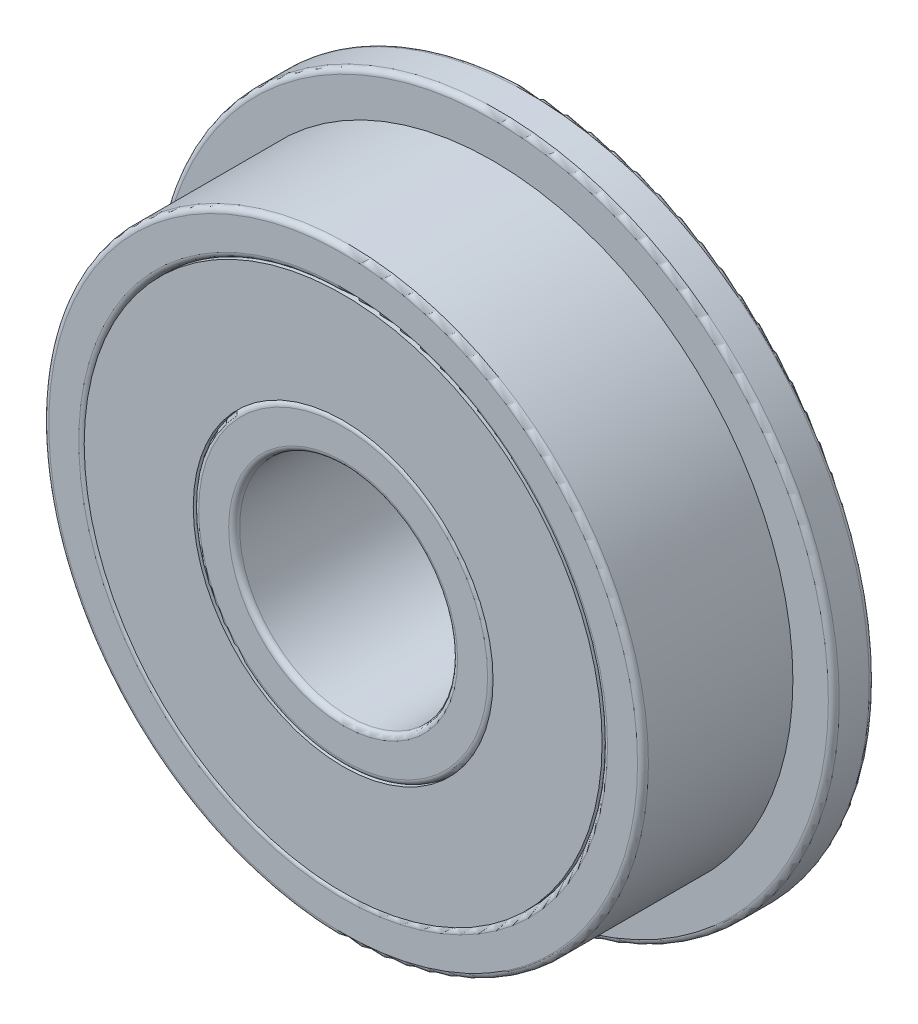
ISO-10303-21;
HEADER;
FILE_DESCRIPTION(('STEP AP214'),'2;1');
FILE_NAME('part.step','',(''),(''),'','','');
FILE_SCHEMA(('AUTOMOTIVE_DESIGN { 1 0 10303 214 1 1 1 1 }'));
ENDSEC;
DATA;
#1=APPLICATION_CONTEXT('core data for automotive mechanical design processes');
#2=APPLICATION_PROTOCOL_DEFINITION('international standard','automotive_design',2000,#1);
#3=PRODUCT_CONTEXT('',#1,'mechanical');
#4=PRODUCT('Part','Part','',(#3));
#5=PRODUCT_RELATED_PRODUCT_CATEGORY('part','',(#4));
#6=PRODUCT_DEFINITION_FORMATION('','',#4);
#7=PRODUCT_DEFINITION_CONTEXT('part definition',#1,'design');
#8=PRODUCT_DEFINITION('design','',#6,#7);
#9=PRODUCT_DEFINITION_SHAPE('','',#8);
#10=(LENGTH_UNIT() NAMED_UNIT(*) SI_UNIT(.MILLI.,.METRE.));
#11=(NAMED_UNIT(*) PLANE_ANGLE_UNIT() SI_UNIT($,.RADIAN.));
#12=(NAMED_UNIT(*) SI_UNIT($,.STERADIAN.) SOLID_ANGLE_UNIT());
#13=UNCERTAINTY_MEASURE_WITH_UNIT(LENGTH_MEASURE(1.E-05),#10,'distance_accuracy_value','');
#14=(GEOMETRIC_REPRESENTATION_CONTEXT(3) GLOBAL_UNCERTAINTY_ASSIGNED_CONTEXT((#13)) GLOBAL_UNIT_ASSIGNED_CONTEXT((#10,
#11,#12)) REPRESENTATION_CONTEXT('',''));
#15=CARTESIAN_POINT('',(0.,0.,0.));
#16=DIRECTION('',(0.,0.,1.));
#17=DIRECTION('',(1.,0.,0.));
#18=AXIS2_PLACEMENT_3D('',#15,#16,#17);
#19=CARTESIAN_POINT('',(0.,0.,7.));
#20=DIRECTION('',(0.,0.,-1.));
#21=DIRECTION('',(-1.,0.,0.));
#22=AXIS2_PLACEMENT_3D('',#19,#20,#21);
#23=CYLINDRICAL_SURFACE('',#22,5.5);
#24=CARTESIAN_POINT('',(0.,0.,7.));
#25=DIRECTION('',(0.,0.,1.));
#26=DIRECTION('',(1.,0.,0.));
#27=AXIS2_PLACEMENT_3D('',#24,#25,#26);
#28=CIRCLE('',#27,5.5);
#29=CARTESIAN_POINT('',(5.5,0.,7.));
#30=VERTEX_POINT('',#29);
#31=EDGE_CURVE('E54',#30,#30,#28,.T.);
#32=ORIENTED_EDGE('',*,*,#31,.T.);
#33=EDGE_LOOP('',(#32));
#34=FACE_BOUND('',#33,.T.);
#35=CARTESIAN_POINT('',(0.,0.,0.));
#36=DIRECTION('',(0.,0.,1.));
#37=DIRECTION('',(1.,0.,0.));
#38=AXIS2_PLACEMENT_3D('',#35,#36,#37);
#39=CIRCLE('',#38,5.5);
#40=CARTESIAN_POINT('',(5.5,0.,0.));
#41=VERTEX_POINT('',#40);
#42=EDGE_CURVE('E60',#41,#41,#39,.T.);
#43=ORIENTED_EDGE('',*,*,#42,.F.);
#44=EDGE_LOOP('',(#43));
#45=FACE_BOUND('',#44,.T.);
#46=ADVANCED_FACE('F47',(#34,#45),#23,.F.);
#47=CARTESIAN_POINT('',(0.,0.,7.));
#48=DIRECTION('',(0.,0.,-1.));
#49=DIRECTION('',(-1.,0.,0.));
#50=AXIS2_PLACEMENT_3D('',#47,#48,#49);
#51=CYLINDRICAL_SURFACE('',#50,9.5);
#52=CARTESIAN_POINT('',(0.,0.,7.));
#53=DIRECTION('',(0.,0.,1.));
#54=DIRECTION('',(1.,0.,0.));
#55=AXIS2_PLACEMENT_3D('',#52,#53,#54);
#56=CIRCLE('',#55,9.5);
#57=CARTESIAN_POINT('',(9.5,0.,7.));
#58=VERTEX_POINT('',#57);
#59=EDGE_CURVE('E12',#58,#58,#56,.T.);
#60=ORIENTED_EDGE('',*,*,#59,.F.);
#61=EDGE_LOOP('',(#60));
#62=FACE_BOUND('',#61,.T.);
#63=CARTESIAN_POINT('',(0.,0.,0.));
#64=DIRECTION('',(0.,0.,1.));
#65=DIRECTION('',(1.,0.,0.));
#66=AXIS2_PLACEMENT_3D('',#63,#64,#65);
#67=CIRCLE('',#66,9.5);
#68=CARTESIAN_POINT('',(9.5,0.,0.));
#69=VERTEX_POINT('',#68);
#70=EDGE_CURVE('E50',#69,#69,#67,.T.);
#71=ORIENTED_EDGE('',*,*,#70,.T.);
#72=EDGE_LOOP('',(#71));
#73=FACE_BOUND('',#72,.T.);
#74=ADVANCED_FACE('F67',(#62,#73),#51,.T.);
#75=CARTESIAN_POINT('',(0.,0.,7.));
#76=DIRECTION('',(0.,0.,1.));
#77=DIRECTION('',(1.,0.,0.));
#78=AXIS2_PLACEMENT_3D('',#75,#76,#77);
#79=PLANE('',#78);
#80=ORIENTED_EDGE('',*,*,#31,.F.);
#81=EDGE_LOOP('',(#80));
#82=FACE_BOUND('',#81,.T.);
#83=ORIENTED_EDGE('',*,*,#59,.T.);
#84=EDGE_LOOP('',(#83));
#85=FACE_BOUND('',#84,.T.);
#86=ADVANCED_FACE('F71',(#82,#85),#79,.T.);
#87=CARTESIAN_POINT('',(0.,0.,0.));
#88=DIRECTION('',(0.,0.,1.));
#89=DIRECTION('',(1.,0.,0.));
#90=AXIS2_PLACEMENT_3D('',#87,#88,#89);
#91=PLANE('',#90);
#92=ORIENTED_EDGE('',*,*,#42,.T.);
#93=EDGE_LOOP('',(#92));
#94=FACE_BOUND('',#93,.T.);
#95=ORIENTED_EDGE('',*,*,#70,.F.);
#96=EDGE_LOOP('',(#95));
#97=FACE_BOUND('',#96,.T.);
#98=ADVANCED_FACE('F69',(#94,#97),#91,.F.);
#99=CLOSED_SHELL('',(#46,#74,#86,#98));
#100=MANIFOLD_SOLID_BREP('B2',#99);
#101=CARTESIAN_POINT('',(0.,0.,7.));
#102=DIRECTION('',(0.,0.,-1.));
#103=DIRECTION('',(-1.,0.,0.));
#104=AXIS2_PLACEMENT_3D('',#101,#102,#103);
#105=CYLINDRICAL_SURFACE('',#104,4.);
#106=CARTESIAN_POINT('',(0.,0.,6.8));
#107=DIRECTION('',(0.,0.,1.));
#108=DIRECTION('',(1.,0.,0.));
#109=AXIS2_PLACEMENT_3D('',#106,#107,#108);
#110=CIRCLE('',#109,4.);
#111=CARTESIAN_POINT('',(4.,0.,6.8));
#112=VERTEX_POINT('',#111);
#113=EDGE_CURVE('E126',#112,#112,#110,.T.);
#114=ORIENTED_EDGE('',*,*,#113,.T.);
#115=EDGE_LOOP('',(#114));
#116=FACE_BOUND('',#115,.T.);
#117=CARTESIAN_POINT('',(0.,0.,0.2));
#118=DIRECTION('',(0.,0.,1.));
#119=DIRECTION('',(1.,0.,0.));
#120=AXIS2_PLACEMENT_3D('',#117,#118,#119);
#121=CIRCLE('',#120,4.);
#122=CARTESIAN_POINT('',(4.,0.,0.2));
#123=VERTEX_POINT('',#122);
#124=EDGE_CURVE('E130',#123,#123,#121,.F.);
#125=ORIENTED_EDGE('',*,*,#124,.T.);
#126=EDGE_LOOP('',(#125));
#127=FACE_BOUND('',#126,.T.);
#128=ADVANCED_FACE('F115',(#116,#127),#105,.F.);
#129=CARTESIAN_POINT('',(0.,0.,7.));
#130=DIRECTION('',(0.,0.,-1.));
#131=DIRECTION('',(-1.,0.,0.));
#132=AXIS2_PLACEMENT_3D('',#129,#130,#131);
#133=CYLINDRICAL_SURFACE('',#132,5.5);
#134=CARTESIAN_POINT('',(0.,0.,6.8));
#135=DIRECTION('',(0.,0.,1.));
#136=DIRECTION('',(1.,0.,0.));
#137=AXIS2_PLACEMENT_3D('',#134,#135,#136);
#138=CIRCLE('',#137,5.5);
#139=CARTESIAN_POINT('',(5.5,0.,6.8));
#140=VERTEX_POINT('',#139);
#141=EDGE_CURVE('E135',#140,#140,#138,.F.);
#142=ORIENTED_EDGE('',*,*,#141,.T.);
#143=EDGE_LOOP('',(#142));
#144=FACE_BOUND('',#143,.T.);
#145=CARTESIAN_POINT('',(0.,0.,0.2));
#146=DIRECTION('',(0.,0.,1.));
#147=DIRECTION('',(1.,0.,0.));
#148=AXIS2_PLACEMENT_3D('',#145,#146,#147);
#149=CIRCLE('',#148,5.5);
#150=CARTESIAN_POINT('',(5.5,0.,0.2));
#151=VERTEX_POINT('',#150);
#152=EDGE_CURVE('E138',#151,#151,#149,.T.);
#153=ORIENTED_EDGE('',*,*,#152,.T.);
#154=EDGE_LOOP('',(#153));
#155=FACE_BOUND('',#154,.T.);
#156=ADVANCED_FACE('F160',(#144,#155),#133,.T.);
#157=CARTESIAN_POINT('',(0.,0.,7.));
#158=DIRECTION('',(0.,0.,1.));
#159=DIRECTION('',(1.,0.,0.));
#160=AXIS2_PLACEMENT_3D('',#157,#158,#159);
#161=PLANE('',#160);
#162=CARTESIAN_POINT('',(0.,0.,7.));
#163=DIRECTION('',(0.,0.,1.));
#164=DIRECTION('',(1.,0.,0.));
#165=AXIS2_PLACEMENT_3D('',#162,#163,#164);
#166=CIRCLE('',#165,5.3);
#167=CARTESIAN_POINT('',(5.3,0.,7.));
#168=VERTEX_POINT('',#167);
#169=EDGE_CURVE('E141',#168,#168,#166,.T.);
#170=ORIENTED_EDGE('',*,*,#169,.T.);
#171=EDGE_LOOP('',(#170));
#172=FACE_BOUND('',#171,.T.);
#173=CARTESIAN_POINT('',(0.,0.,7.));
#174=DIRECTION('',(0.,0.,1.));
#175=DIRECTION('',(1.,0.,0.));
#176=AXIS2_PLACEMENT_3D('',#173,#174,#175);
#177=CIRCLE('',#176,4.2);
#178=CARTESIAN_POINT('',(4.2,0.,7.));
#179=VERTEX_POINT('',#178);
#180=EDGE_CURVE('E144',#179,#179,#177,.F.);
#181=ORIENTED_EDGE('',*,*,#180,.T.);
#182=EDGE_LOOP('',(#181));
#183=FACE_BOUND('',#182,.T.);
#184=ADVANCED_FACE('F148',(#172,#183),#161,.T.);
#185=CARTESIAN_POINT('',(0.,0.,0.));
#186=DIRECTION('',(0.,0.,1.));
#187=DIRECTION('',(1.,0.,0.));
#188=AXIS2_PLACEMENT_3D('',#185,#186,#187);
#189=PLANE('',#188);
#190=CARTESIAN_POINT('',(0.,0.,0.));
#191=DIRECTION('',(0.,0.,1.));
#192=DIRECTION('',(1.,0.,0.));
#193=AXIS2_PLACEMENT_3D('',#190,#191,#192);
#194=CIRCLE('',#193,5.3);
#195=CARTESIAN_POINT('',(5.3,0.,0.));
#196=VERTEX_POINT('',#195);
#197=EDGE_CURVE('E46',#196,#196,#194,.F.);
#198=ORIENTED_EDGE('',*,*,#197,.T.);
#199=EDGE_LOOP('',(#198));
#200=FACE_BOUND('',#199,.T.);
#201=CARTESIAN_POINT('',(0.,0.,0.));
#202=DIRECTION('',(0.,0.,1.));
#203=DIRECTION('',(1.,0.,0.));
#204=AXIS2_PLACEMENT_3D('',#201,#202,#203);
#205=CIRCLE('',#204,4.2);
#206=CARTESIAN_POINT('',(4.2,0.,0.));
#207=VERTEX_POINT('',#206);
#208=EDGE_CURVE('E122',#207,#207,#205,.T.);
#209=ORIENTED_EDGE('',*,*,#208,.T.);
#210=EDGE_LOOP('',(#209));
#211=FACE_BOUND('',#210,.T.);
#212=ADVANCED_FACE('F175',(#200,#211),#189,.F.);
#213=CARTESIAN_POINT('',(0.,0.,6.8));
#214=DIRECTION('',(0.,0.,1.));
#215=DIRECTION('',(1.,0.,0.));
#216=AXIS2_PLACEMENT_3D('',#213,#214,#215);
#217=TOROIDAL_SURFACE('',#216,5.3,0.2);
#218=ORIENTED_EDGE('',*,*,#141,.F.);
#219=EDGE_LOOP('',(#218));
#220=FACE_BOUND('',#219,.T.);
#221=ORIENTED_EDGE('',*,*,#169,.F.);
#222=EDGE_LOOP('',(#221));
#223=FACE_BOUND('',#222,.T.);
#224=ADVANCED_FACE('F154',(#220,#223),#217,.T.);
#225=CARTESIAN_POINT('',(0.,0.,6.8));
#226=DIRECTION('',(0.,0.,1.));
#227=DIRECTION('',(1.,0.,0.));
#228=AXIS2_PLACEMENT_3D('',#225,#226,#227);
#229=TOROIDAL_SURFACE('',#228,4.2,0.2);
#230=ORIENTED_EDGE('',*,*,#180,.F.);
#231=EDGE_LOOP('',(#230));
#232=FACE_BOUND('',#231,.T.);
#233=ORIENTED_EDGE('',*,*,#113,.F.);
#234=EDGE_LOOP('',(#233));
#235=FACE_BOUND('',#234,.T.);
#236=ADVANCED_FACE('F150',(#232,#235),#229,.T.);
#237=CARTESIAN_POINT('',(0.,0.,0.2));
#238=DIRECTION('',(0.,0.,1.));
#239=DIRECTION('',(1.,0.,0.));
#240=AXIS2_PLACEMENT_3D('',#237,#238,#239);
#241=TOROIDAL_SURFACE('',#240,5.3,0.2);
#242=ORIENTED_EDGE('',*,*,#197,.F.);
#243=EDGE_LOOP('',(#242));
#244=FACE_BOUND('',#243,.T.);
#245=ORIENTED_EDGE('',*,*,#152,.F.);
#246=EDGE_LOOP('',(#245));
#247=FACE_BOUND('',#246,.T.);
#248=ADVANCED_FACE('F153',(#244,#247),#241,.T.);
#249=CARTESIAN_POINT('',(0.,0.,0.2));
#250=DIRECTION('',(0.,0.,1.));
#251=DIRECTION('',(1.,0.,0.));
#252=AXIS2_PLACEMENT_3D('',#249,#250,#251);
#253=TOROIDAL_SURFACE('',#252,4.2,0.2);
#254=ORIENTED_EDGE('',*,*,#124,.F.);
#255=EDGE_LOOP('',(#254));
#256=FACE_BOUND('',#255,.T.);
#257=ORIENTED_EDGE('',*,*,#208,.F.);
#258=EDGE_LOOP('',(#257));
#259=FACE_BOUND('',#258,.T.);
#260=ADVANCED_FACE('F117',(#256,#259),#253,.T.);
#261=CLOSED_SHELL('',(#128,#156,#184,#212,#224,#236,#248,#260));
#262=MANIFOLD_SOLID_BREP('B7',#261);
#263=CARTESIAN_POINT('',(0.,0.,7.));
#264=DIRECTION('',(0.,0.,-1.));
#265=DIRECTION('',(-1.,0.,0.));
#266=AXIS2_PLACEMENT_3D('',#263,#264,#265);
#267=CYLINDRICAL_SURFACE('',#266,9.5);
#268=CARTESIAN_POINT('',(0.,0.,0.2));
#269=DIRECTION('',(0.,0.,1.));
#270=DIRECTION('',(1.,0.,0.));
#271=AXIS2_PLACEMENT_3D('',#268,#269,#270);
#272=CIRCLE('',#271,9.5);
#273=CARTESIAN_POINT('',(9.5,0.,0.2));
#274=VERTEX_POINT('',#273);
#275=EDGE_CURVE('E256',#274,#274,#272,.F.);
#276=ORIENTED_EDGE('',*,*,#275,.T.);
#277=EDGE_LOOP('',(#276));
#278=FACE_BOUND('',#277,.T.);
#279=CARTESIAN_POINT('',(0.,0.,6.8));
#280=DIRECTION('',(0.,0.,1.));
#281=DIRECTION('',(1.,0.,0.));
#282=AXIS2_PLACEMENT_3D('',#279,#280,#281);
#283=CIRCLE('',#282,9.5);
#284=CARTESIAN_POINT('',(9.5,0.,6.8));
#285=VERTEX_POINT('',#284);
#286=EDGE_CURVE('E259',#285,#285,#283,.T.);
#287=ORIENTED_EDGE('',*,*,#286,.T.);
#288=EDGE_LOOP('',(#287));
#289=FACE_BOUND('',#288,.T.);
#290=ADVANCED_FACE('F236',(#278,#289),#267,.F.);
#291=CARTESIAN_POINT('',(0.,0.,7.));
#292=DIRECTION('',(0.,0.,-1.));
#293=DIRECTION('',(-1.,0.,0.));
#294=AXIS2_PLACEMENT_3D('',#291,#292,#293);
#295=CYLINDRICAL_SURFACE('',#294,11.);
#296=CARTESIAN_POINT('',(0.,0.,6.8));
#297=DIRECTION('',(0.,0.,1.));
#298=DIRECTION('',(1.,0.,0.));
#299=AXIS2_PLACEMENT_3D('',#296,#297,#298);
#300=CIRCLE('',#299,11.);
#301=CARTESIAN_POINT('',(11.,0.,6.8));
#302=VERTEX_POINT('',#301);
#303=EDGE_CURVE('E243',#302,#302,#300,.F.);
#304=ORIENTED_EDGE('',*,*,#303,.T.);
#305=EDGE_LOOP('',(#304));
#306=FACE_BOUND('',#305,.T.);
#307=CARTESIAN_POINT('',(0.,0.,1.5));
#308=DIRECTION('',(0.,0.,1.));
#309=DIRECTION('',(1.,0.,0.));
#310=AXIS2_PLACEMENT_3D('',#307,#308,#309);
#311=CIRCLE('',#310,11.);
#312=CARTESIAN_POINT('',(11.,0.,1.5));
#313=VERTEX_POINT('',#312);
#314=EDGE_CURVE('E274',#313,#313,#311,.T.);
#315=ORIENTED_EDGE('',*,*,#314,.T.);
#316=EDGE_LOOP('',(#315));
#317=FACE_BOUND('',#316,.T.);
#318=ADVANCED_FACE('F278',(#306,#317),#295,.T.);
#319=CARTESIAN_POINT('',(0.,0.,7.));
#320=DIRECTION('',(0.,0.,1.));
#321=DIRECTION('',(1.,0.,0.));
#322=AXIS2_PLACEMENT_3D('',#319,#320,#321);
#323=PLANE('',#322);
#324=CARTESIAN_POINT('',(0.,0.,7.));
#325=DIRECTION('',(0.,0.,1.));
#326=DIRECTION('',(1.,0.,0.));
#327=AXIS2_PLACEMENT_3D('',#324,#325,#326);
#328=CIRCLE('',#327,10.8);
#329=CARTESIAN_POINT('',(10.8,0.,7.));
#330=VERTEX_POINT('',#329);
#331=EDGE_CURVE('E247',#330,#330,#328,.T.);
#332=ORIENTED_EDGE('',*,*,#331,.T.);
#333=EDGE_LOOP('',(#332));
#334=FACE_BOUND('',#333,.T.);
#335=CARTESIAN_POINT('',(0.,0.,7.));
#336=DIRECTION('',(0.,0.,1.));
#337=DIRECTION('',(1.,0.,0.));
#338=AXIS2_PLACEMENT_3D('',#335,#336,#337);
#339=CIRCLE('',#338,9.7);
#340=CARTESIAN_POINT('',(9.7,0.,7.));
#341=VERTEX_POINT('',#340);
#342=EDGE_CURVE('E251',#341,#341,#339,.F.);
#343=ORIENTED_EDGE('',*,*,#342,.T.);
#344=EDGE_LOOP('',(#343));
#345=FACE_BOUND('',#344,.T.);
#346=ADVANCED_FACE('F292',(#334,#345),#323,.T.);
#347=CARTESIAN_POINT('',(0.,0.,0.));
#348=DIRECTION('',(0.,0.,1.));
#349=DIRECTION('',(1.,0.,0.));
#350=AXIS2_PLACEMENT_3D('',#347,#348,#349);
#351=PLANE('',#350);
#352=CARTESIAN_POINT('',(0.,0.,0.));
#353=DIRECTION('',(0.,0.,1.));
#354=DIRECTION('',(1.,0.,0.));
#355=AXIS2_PLACEMENT_3D('',#352,#353,#354);
#356=CIRCLE('',#355,12.3);
#357=CARTESIAN_POINT('',(12.3,0.,0.));
#358=VERTEX_POINT('',#357);
#359=EDGE_CURVE('E262',#358,#358,#356,.F.);
#360=ORIENTED_EDGE('',*,*,#359,.T.);
#361=EDGE_LOOP('',(#360));
#362=FACE_BOUND('',#361,.T.);
#363=CARTESIAN_POINT('',(0.,0.,0.));
#364=DIRECTION('',(0.,0.,1.));
#365=DIRECTION('',(1.,0.,0.));
#366=AXIS2_PLACEMENT_3D('',#363,#364,#365);
#367=CIRCLE('',#366,9.7);
#368=CARTESIAN_POINT('',(9.7,0.,0.));
#369=VERTEX_POINT('',#368);
#370=EDGE_CURVE('E265',#369,#369,#367,.T.);
#371=ORIENTED_EDGE('',*,*,#370,.T.);
#372=EDGE_LOOP('',(#371));
#373=FACE_BOUND('',#372,.T.);
#374=ADVANCED_FACE('F283',(#362,#373),#351,.F.);
#375=CARTESIAN_POINT('',(0.,0.,1.5));
#376=DIRECTION('',(0.,0.,1.));
#377=DIRECTION('',(1.,0.,0.));
#378=AXIS2_PLACEMENT_3D('',#375,#376,#377);
#379=PLANE('',#378);
#380=CARTESIAN_POINT('',(0.,0.,1.5));
#381=DIRECTION('',(0.,0.,1.));
#382=DIRECTION('',(1.,0.,0.));
#383=AXIS2_PLACEMENT_3D('',#380,#381,#382);
#384=CIRCLE('',#383,12.3);
#385=CARTESIAN_POINT('',(12.3,0.,1.5));
#386=VERTEX_POINT('',#385);
#387=EDGE_CURVE('E114',#386,#386,#384,.T.);
#388=ORIENTED_EDGE('',*,*,#387,.T.);
#389=EDGE_LOOP('',(#388));
#390=FACE_BOUND('',#389,.T.);
#391=ORIENTED_EDGE('',*,*,#314,.F.);
#392=EDGE_LOOP('',(#391));
#393=FACE_BOUND('',#392,.T.);
#394=ADVANCED_FACE('F280',(#390,#393),#379,.T.);
#395=CARTESIAN_POINT('',(0.,0.,1.5));
#396=DIRECTION('',(0.,0.,-1.));
#397=DIRECTION('',(-1.,0.,0.));
#398=AXIS2_PLACEMENT_3D('',#395,#396,#397);
#399=CYLINDRICAL_SURFACE('',#398,12.5);
#400=CARTESIAN_POINT('',(0.,0.,0.2));
#401=DIRECTION('',(0.,0.,1.));
#402=DIRECTION('',(1.,0.,0.));
#403=AXIS2_PLACEMENT_3D('',#400,#401,#402);
#404=CIRCLE('',#403,12.5);
#405=CARTESIAN_POINT('',(12.5,0.,0.2));
#406=VERTEX_POINT('',#405);
#407=EDGE_CURVE('E268',#406,#406,#404,.T.);
#408=ORIENTED_EDGE('',*,*,#407,.T.);
#409=EDGE_LOOP('',(#408));
#410=FACE_BOUND('',#409,.T.);
#411=CARTESIAN_POINT('',(0.,0.,1.3));
#412=DIRECTION('',(0.,0.,1.));
#413=DIRECTION('',(1.,0.,0.));
#414=AXIS2_PLACEMENT_3D('',#411,#412,#413);
#415=CIRCLE('',#414,12.5);
#416=CARTESIAN_POINT('',(12.5,0.,1.3));
#417=VERTEX_POINT('',#416);
#418=EDGE_CURVE('E271',#417,#417,#415,.F.);
#419=ORIENTED_EDGE('',*,*,#418,.T.);
#420=EDGE_LOOP('',(#419));
#421=FACE_BOUND('',#420,.T.);
#422=ADVANCED_FACE('F282',(#410,#421),#399,.T.);
#423=CARTESIAN_POINT('',(0.,0.,0.2));
#424=DIRECTION('',(0.,0.,1.));
#425=DIRECTION('',(1.,0.,0.));
#426=AXIS2_PLACEMENT_3D('',#423,#424,#425);
#427=TOROIDAL_SURFACE('',#426,12.3,0.2);
#428=ORIENTED_EDGE('',*,*,#359,.F.);
#429=EDGE_LOOP('',(#428));
#430=FACE_BOUND('',#429,.T.);
#431=ORIENTED_EDGE('',*,*,#407,.F.);
#432=EDGE_LOOP('',(#431));
#433=FACE_BOUND('',#432,.T.);
#434=ADVANCED_FACE('F289',(#430,#433),#427,.T.);
#435=CARTESIAN_POINT('',(0.,0.,0.2));
#436=DIRECTION('',(0.,0.,1.));
#437=DIRECTION('',(1.,0.,0.));
#438=AXIS2_PLACEMENT_3D('',#435,#436,#437);
#439=TOROIDAL_SURFACE('',#438,9.7,0.2);
#440=ORIENTED_EDGE('',*,*,#275,.F.);
#441=EDGE_LOOP('',(#440));
#442=FACE_BOUND('',#441,.T.);
#443=ORIENTED_EDGE('',*,*,#370,.F.);
#444=EDGE_LOOP('',(#443));
#445=FACE_BOUND('',#444,.T.);
#446=ADVANCED_FACE('F306',(#442,#445),#439,.T.);
#447=CARTESIAN_POINT('',(0.,0.,6.8));
#448=DIRECTION('',(0.,0.,1.));
#449=DIRECTION('',(1.,0.,0.));
#450=AXIS2_PLACEMENT_3D('',#447,#448,#449);
#451=TOROIDAL_SURFACE('',#450,10.8,0.2);
#452=ORIENTED_EDGE('',*,*,#303,.F.);
#453=EDGE_LOOP('',(#452));
#454=FACE_BOUND('',#453,.T.);
#455=ORIENTED_EDGE('',*,*,#331,.F.);
#456=EDGE_LOOP('',(#455));
#457=FACE_BOUND('',#456,.T.);
#458=ADVANCED_FACE('F310',(#454,#457),#451,.T.);
#459=CARTESIAN_POINT('',(0.,0.,6.8));
#460=DIRECTION('',(0.,0.,1.));
#461=DIRECTION('',(1.,0.,0.));
#462=AXIS2_PLACEMENT_3D('',#459,#460,#461);
#463=TOROIDAL_SURFACE('',#462,9.7,0.2);
#464=ORIENTED_EDGE('',*,*,#342,.F.);
#465=EDGE_LOOP('',(#464));
#466=FACE_BOUND('',#465,.T.);
#467=ORIENTED_EDGE('',*,*,#286,.F.);
#468=EDGE_LOOP('',(#467));
#469=FACE_BOUND('',#468,.T.);
#470=ADVANCED_FACE('F313',(#466,#469),#463,.T.);
#471=CARTESIAN_POINT('',(0.,0.,1.3));
#472=DIRECTION('',(0.,0.,1.));
#473=DIRECTION('',(1.,0.,0.));
#474=AXIS2_PLACEMENT_3D('',#471,#472,#473);
#475=TOROIDAL_SURFACE('',#474,12.3,0.2);
#476=ORIENTED_EDGE('',*,*,#418,.F.);
#477=EDGE_LOOP('',(#476));
#478=FACE_BOUND('',#477,.T.);
#479=ORIENTED_EDGE('',*,*,#387,.F.);
#480=EDGE_LOOP('',(#479));
#481=FACE_BOUND('',#480,.T.);
#482=ADVANCED_FACE('F238',(#478,#481),#475,.T.);
#483=CLOSED_SHELL('',(#290,#318,#346,#374,#394,#422,#434,#446,#458,#470,#482));
#484=MANIFOLD_SOLID_BREP('B41',#483);
#485=ADVANCED_BREP_SHAPE_REPRESENTATION('',(#18,#100,#262,#484),#14);
#486=SHAPE_DEFINITION_REPRESENTATION(#9,#485);
ENDSEC;
END-ISO-10303-21;
